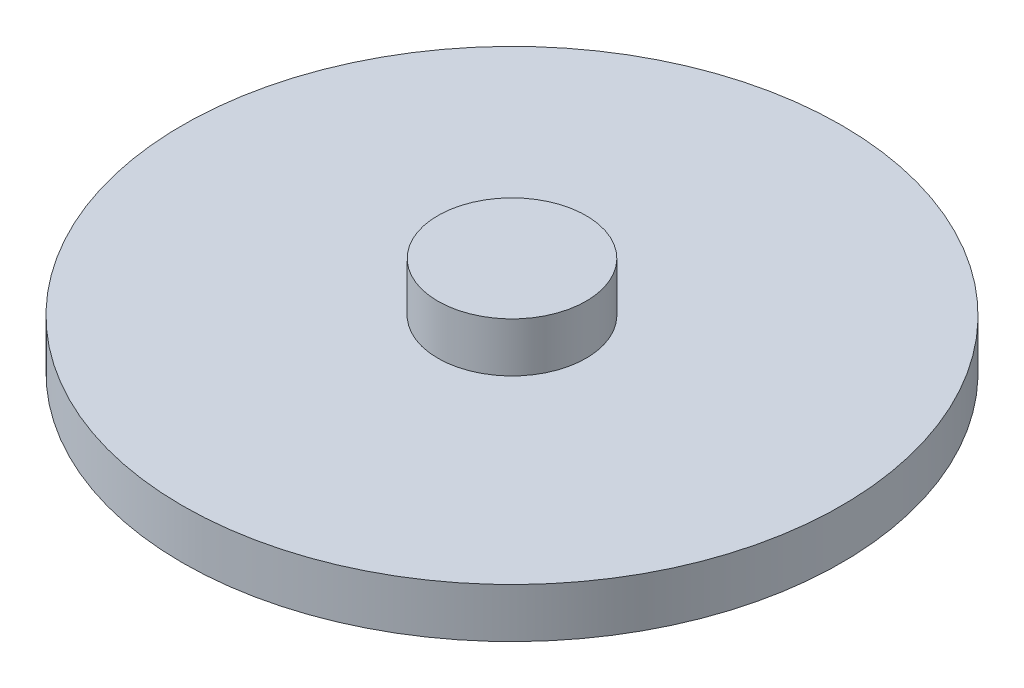
ISO-10303-21;
HEADER;
FILE_DESCRIPTION(('STEP AP214'),'2;1');
FILE_NAME('part.step','',(''),(''),'','','');
FILE_SCHEMA(('AUTOMOTIVE_DESIGN { 1 0 10303 214 1 1 1 1 }'));
ENDSEC;
DATA;
#1=APPLICATION_CONTEXT('core data for automotive mechanical design processes');
#2=APPLICATION_PROTOCOL_DEFINITION('international standard','automotive_design',2000,#1);
#3=PRODUCT_CONTEXT('',#1,'mechanical');
#4=PRODUCT('Part','Part','',(#3));
#5=PRODUCT_RELATED_PRODUCT_CATEGORY('part','',(#4));
#6=PRODUCT_DEFINITION_FORMATION('','',#4);
#7=PRODUCT_DEFINITION_CONTEXT('part definition',#1,'design');
#8=PRODUCT_DEFINITION('design','',#6,#7);
#9=PRODUCT_DEFINITION_SHAPE('','',#8);
#10=(LENGTH_UNIT() NAMED_UNIT(*) SI_UNIT(.MILLI.,.METRE.));
#11=(NAMED_UNIT(*) PLANE_ANGLE_UNIT() SI_UNIT($,.RADIAN.));
#12=(NAMED_UNIT(*) SI_UNIT($,.STERADIAN.) SOLID_ANGLE_UNIT());
#13=UNCERTAINTY_MEASURE_WITH_UNIT(LENGTH_MEASURE(1.E-05),#10,'distance_accuracy_value','');
#14=(GEOMETRIC_REPRESENTATION_CONTEXT(3) GLOBAL_UNCERTAINTY_ASSIGNED_CONTEXT((#13)) GLOBAL_UNIT_ASSIGNED_CONTEXT((#10,
#11,#12)) REPRESENTATION_CONTEXT('',''));
#15=CARTESIAN_POINT('',(0.,0.,0.));
#16=DIRECTION('',(0.,0.,1.));
#17=DIRECTION('',(1.,0.,0.));
#18=AXIS2_PLACEMENT_3D('',#15,#16,#17);
#19=CARTESIAN_POINT('',(-10.2690972160318,3.,-11.3840277709153));
#20=DIRECTION('',(0.,-1.,0.));
#21=DIRECTION('',(0.,0.,-1.));
#22=AXIS2_PLACEMENT_3D('',#19,#20,#21);
#23=CYLINDRICAL_SURFACE('',#22,20.);
#24=CARTESIAN_POINT('',(-10.2690972160318,3.,-11.3840277709153));
#25=DIRECTION('',(0.,1.,0.));
#26=DIRECTION('',(0.,0.,1.));
#27=AXIS2_PLACEMENT_3D('',#24,#25,#26);
#28=CIRCLE('',#27,20.);
#29=CARTESIAN_POINT('',(-10.2690972160318,3.,8.61597222908471));
#30=VERTEX_POINT('',#29);
#31=EDGE_CURVE('E51',#30,#30,#28,.T.);
#32=ORIENTED_EDGE('',*,*,#31,.F.);
#33=EDGE_LOOP('',(#32));
#34=FACE_BOUND('',#33,.T.);
#35=CARTESIAN_POINT('',(-10.2690972160318,0.,-11.3840277709153));
#36=DIRECTION('',(0.,1.,0.));
#37=DIRECTION('',(0.,0.,1.));
#38=AXIS2_PLACEMENT_3D('',#35,#36,#37);
#39=CIRCLE('',#38,20.);
#40=CARTESIAN_POINT('',(-10.2690972160318,0.,8.61597222908471));
#41=VERTEX_POINT('',#40);
#42=EDGE_CURVE('E46',#41,#41,#39,.T.);
#43=ORIENTED_EDGE('',*,*,#42,.T.);
#44=EDGE_LOOP('',(#43));
#45=FACE_BOUND('',#44,.T.);
#46=ADVANCED_FACE('F43',(#34,#45),#23,.T.);
#47=CARTESIAN_POINT('',(-10.2690972160318,3.,-11.3840277709153));
#48=DIRECTION('',(0.,1.,0.));
#49=DIRECTION('',(0.,0.,1.));
#50=AXIS2_PLACEMENT_3D('',#47,#48,#49);
#51=PLANE('',#50);
#52=CARTESIAN_POINT('',(-10.2690972160318,3.,-11.3840277709153));
#53=DIRECTION('',(0.,1.,0.));
#54=DIRECTION('',(0.,0.,1.));
#55=AXIS2_PLACEMENT_3D('',#52,#53,#54);
#56=CIRCLE('',#55,4.5);
#57=CARTESIAN_POINT('',(-10.2690972160318,3.,-6.88402777091529));
#58=VERTEX_POINT('',#57);
#59=EDGE_CURVE('E10',#58,#58,#56,.T.);
#60=ORIENTED_EDGE('',*,*,#59,.F.);
#61=EDGE_LOOP('',(#60));
#62=FACE_BOUND('',#61,.T.);
#63=ORIENTED_EDGE('',*,*,#31,.T.);
#64=EDGE_LOOP('',(#63));
#65=FACE_BOUND('',#64,.T.);
#66=ADVANCED_FACE('F73',(#62,#65),#51,.T.);
#67=CARTESIAN_POINT('',(-10.2690972160318,0.,-11.3840277709153));
#68=DIRECTION('',(0.,1.,0.));
#69=DIRECTION('',(0.,0.,1.));
#70=AXIS2_PLACEMENT_3D('',#67,#68,#69);
#71=PLANE('',#70);
#72=ORIENTED_EDGE('',*,*,#42,.F.);
#73=EDGE_LOOP('',(#72));
#74=FACE_BOUND('',#73,.T.);
#75=ADVANCED_FACE('F66',(#74),#71,.F.);
#76=CARTESIAN_POINT('',(-10.2690972160318,6.,-11.3840277709153));
#77=DIRECTION('',(0.,-1.,0.));
#78=DIRECTION('',(0.,0.,-1.));
#79=AXIS2_PLACEMENT_3D('',#76,#77,#78);
#80=CYLINDRICAL_SURFACE('',#79,4.5);
#81=CARTESIAN_POINT('',(-10.2690972160318,6.,-11.3840277709153));
#82=DIRECTION('',(0.,1.,0.));
#83=DIRECTION('',(0.,0.,1.));
#84=AXIS2_PLACEMENT_3D('',#81,#82,#83);
#85=CIRCLE('',#84,4.5);
#86=CARTESIAN_POINT('',(-10.2690972160318,6.,-6.88402777091529));
#87=VERTEX_POINT('',#86);
#88=EDGE_CURVE('E59',#87,#87,#85,.T.);
#89=ORIENTED_EDGE('',*,*,#88,.F.);
#90=EDGE_LOOP('',(#89));
#91=FACE_BOUND('',#90,.T.);
#92=ORIENTED_EDGE('',*,*,#59,.T.);
#93=EDGE_LOOP('',(#92));
#94=FACE_BOUND('',#93,.T.);
#95=ADVANCED_FACE('F68',(#91,#94),#80,.T.);
#96=CARTESIAN_POINT('',(-10.2690972160318,6.,-11.3840277709153));
#97=DIRECTION('',(0.,1.,0.));
#98=DIRECTION('',(0.,0.,1.));
#99=AXIS2_PLACEMENT_3D('',#96,#97,#98);
#100=PLANE('',#99);
#101=ORIENTED_EDGE('',*,*,#88,.T.);
#102=EDGE_LOOP('',(#101));
#103=FACE_BOUND('',#102,.T.);
#104=ADVANCED_FACE('F77',(#103),#100,.T.);
#105=CLOSED_SHELL('',(#46,#66,#75,#95,#104));
#106=MANIFOLD_SOLID_BREP('B2',#105);
#107=ADVANCED_BREP_SHAPE_REPRESENTATION('',(#18,#106),#14);
#108=SHAPE_DEFINITION_REPRESENTATION(#9,#107);
ENDSEC;
END-ISO-10303-21;
